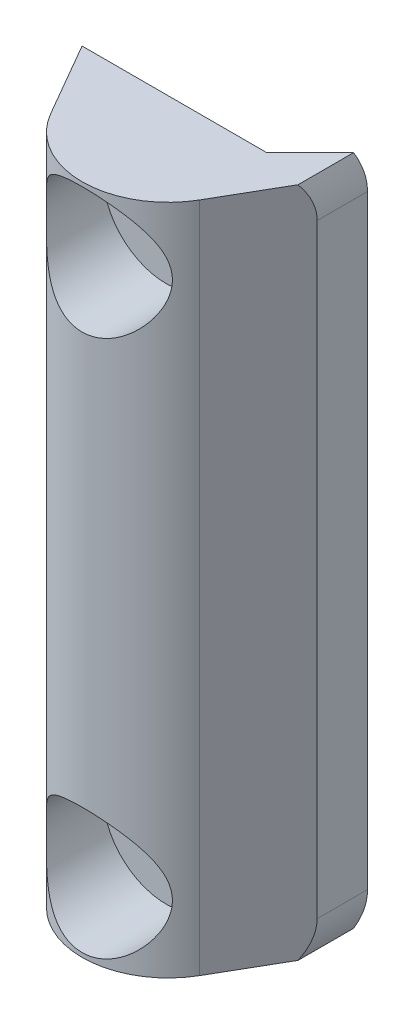
ISO-10303-21;
HEADER;
FILE_DESCRIPTION(('STEP AP214'),'2;1');
FILE_NAME('part.step','',(''),(''),'','','');
FILE_SCHEMA(('AUTOMOTIVE_DESIGN { 1 0 10303 214 1 1 1 1 }'));
ENDSEC;
DATA;
#1=APPLICATION_CONTEXT('core data for automotive mechanical design processes');
#2=APPLICATION_PROTOCOL_DEFINITION('international standard','automotive_design',2000,#1);
#3=PRODUCT_CONTEXT('',#1,'mechanical');
#4=PRODUCT('Part','Part','',(#3));
#5=PRODUCT_RELATED_PRODUCT_CATEGORY('part','',(#4));
#6=PRODUCT_DEFINITION_FORMATION('','',#4);
#7=PRODUCT_DEFINITION_CONTEXT('part definition',#1,'design');
#8=PRODUCT_DEFINITION('design','',#6,#7);
#9=PRODUCT_DEFINITION_SHAPE('','',#8);
#10=(LENGTH_UNIT() NAMED_UNIT(*) SI_UNIT(.MILLI.,.METRE.));
#11=(NAMED_UNIT(*) PLANE_ANGLE_UNIT() SI_UNIT($,.RADIAN.));
#12=(NAMED_UNIT(*) SI_UNIT($,.STERADIAN.) SOLID_ANGLE_UNIT());
#13=UNCERTAINTY_MEASURE_WITH_UNIT(LENGTH_MEASURE(1.E-05),#10,'distance_accuracy_value','');
#14=(GEOMETRIC_REPRESENTATION_CONTEXT(3) GLOBAL_UNCERTAINTY_ASSIGNED_CONTEXT((#13)) GLOBAL_UNIT_ASSIGNED_CONTEXT((#10,
#11,#12)) REPRESENTATION_CONTEXT('',''));
#15=CARTESIAN_POINT('',(0.,0.,0.));
#16=DIRECTION('',(0.,0.,1.));
#17=DIRECTION('',(1.,0.,0.));
#18=AXIS2_PLACEMENT_3D('',#15,#16,#17);
#19=CARTESIAN_POINT('',(7.00000000000001,44.2426406871193,-1.8756443470178));
#20=DIRECTION('',(-1.,0.,0.));
#21=DIRECTION('',(0.,0.,1.));
#22=AXIS2_PLACEMENT_3D('',#19,#20,#21);
#23=PLANE('',#22);
#24=DIRECTION('',(0.,0.,1.));
#25=VECTOR('',#24,1.);
#26=CARTESIAN_POINT('',(7.,38.,-4.8766443470178));
#27=LINE('',#26,#25);
#28=CARTESIAN_POINT('',(7.00000000000001,38.,-4.8756443470178));
#29=VERTEX_POINT('',#28);
#30=CARTESIAN_POINT('',(7.,38.,-1.8756443470178));
#31=VERTEX_POINT('',#30);
#32=EDGE_CURVE('E62',#29,#31,#27,.T.);
#33=ORIENTED_EDGE('',*,*,#32,.T.);
#34=DIRECTION('',(0.,-1.,0.));
#35=VECTOR('',#34,1.);
#36=CARTESIAN_POINT('',(7.,40.,-1.8756443470178));
#37=LINE('',#36,#35);
#38=CARTESIAN_POINT('',(7.,2.,-1.8756443470178));
#39=VERTEX_POINT('',#38);
#40=EDGE_CURVE('E47',#31,#39,#37,.T.);
#41=ORIENTED_EDGE('',*,*,#40,.T.);
#42=DIRECTION('',(0.,0.,1.));
#43=VECTOR('',#42,1.);
#44=CARTESIAN_POINT('',(7.,2.,-4.8766443470178));
#45=LINE('',#44,#43);
#46=CARTESIAN_POINT('',(7.,2.,-4.8756443470178));
#47=VERTEX_POINT('',#46);
#48=EDGE_CURVE('E254',#47,#39,#45,.T.);
#49=ORIENTED_EDGE('',*,*,#48,.F.);
#50=DIRECTION('',(0.,-1.,0.));
#51=VECTOR('',#50,1.);
#52=CARTESIAN_POINT('',(7.00000000000001,44.2426406871193,-4.8756443470178));
#53=LINE('',#52,#51);
#54=EDGE_CURVE('E109',#29,#47,#53,.T.);
#55=ORIENTED_EDGE('',*,*,#54,.F.);
#56=EDGE_LOOP('',(#33,#41,#49,#55));
#57=FACE_BOUND('',#56,.T.);
#58=ADVANCED_FACE('F39',(#57),#23,.F.);
#59=CARTESIAN_POINT('',(0.,40.,0.));
#60=DIRECTION('',(0.,-1.,0.));
#61=DIRECTION('',(0.,0.,-1.));
#62=AXIS2_PLACEMENT_3D('',#59,#60,#61);
#63=CYLINDRICAL_SURFACE('',#62,5.1243556529822);
#64=CARTESIAN_POINT('',(-3.75,4.,3.49235176610985));
#65=CARTESIAN_POINT('',(-3.75000082817432,3.91156320383128,3.4923503929677));
#66=CARTESIAN_POINT('',(-3.74686443987994,3.82313168687699,3.49572761415757));
#67=CARTESIAN_POINT('',(-3.73440650241471,3.64716548087393,3.50903280656132));
#68=CARTESIAN_POINT('',(-3.72508180563202,3.55963127124982,3.51896411142));
#69=CARTESIAN_POINT('',(-3.70045317631584,3.38612479252614,3.54485310385295));
#70=CARTESIAN_POINT('',(-3.68513600555023,3.30015642571689,3.560824131413));
#71=CARTESIAN_POINT('',(-3.64884911950112,3.13055641214242,3.5979987903687));
#72=CARTESIAN_POINT('',(-3.62787602935394,3.04692619353016,3.61920554526076));
#73=CARTESIAN_POINT('',(-3.55764701219401,2.80245512295211,3.68869235687381));
#74=CARTESIAN_POINT('',(-3.50071123533599,2.64555086867177,3.74325636214103));
#75=CARTESIAN_POINT('',(-3.36862678820535,2.34410112674241,3.86254921993245));
#76=CARTESIAN_POINT('',(-3.29347938898637,2.19955477754342,3.92727736295452));
#77=CARTESIAN_POINT('',(-3.11001622126509,1.89580077257696,4.07470778029398));
#78=CARTESIAN_POINT('',(-2.9980858523965,1.73927764365495,4.15844546242896));
#79=CARTESIAN_POINT('',(-2.75137587065141,1.4447396029857,4.32564396383491));
#80=CARTESIAN_POINT('',(-2.61656484441367,1.30675061012624,4.40910423943241));
#81=CARTESIAN_POINT('',(-2.38418627603352,1.10320159048506,4.53701527767008));
#82=CARTESIAN_POINT('',(-2.29360095879861,1.03091605576585,4.58359380421135));
#83=CARTESIAN_POINT('',(-2.1049834399495,0.894344831184097,4.67321659306353));
#84=CARTESIAN_POINT('',(-2.00695467575506,0.830055484395187,4.71626246788831));
#85=CARTESIAN_POINT('',(-1.8039623722087,0.710307427619104,4.79756929067917));
#86=CARTESIAN_POINT('',(-1.6990091978739,0.654835924496708,4.83583715306744));
#87=CARTESIAN_POINT('',(-1.48273692897054,0.553515411426955,4.90647135192091));
#88=CARTESIAN_POINT('',(-1.3714210068502,0.507661658441894,4.93884059627847));
#89=CARTESIAN_POINT('',(-1.09528751862583,0.409408797743708,5.00871284853145));
#90=CARTESIAN_POINT('',(-0.927606219137249,0.3623259055356,5.04267820189372));
#91=CARTESIAN_POINT('',(-0.584971203863564,0.291783435501948,5.09380013181278));
#92=CARTESIAN_POINT('',(-0.410023770764594,0.268303874239571,5.11097092691862));
#93=CARTESIAN_POINT('',(-0.057277843436265,0.24626833036834,5.12708126561203));
#94=CARTESIAN_POINT('',(0.120526374626158,0.247770924330748,5.1259779612745));
#95=CARTESIAN_POINT('',(0.473095590039999,0.275758452857493,5.10552712885448));
#96=CARTESIAN_POINT('',(0.647859808472965,0.302249696796877,5.08617499313165));
#97=CARTESIAN_POINT('',(0.984237682890889,0.377485057845345,5.03174799811459));
#98=CARTESIAN_POINT('',(1.14608851011734,0.425538263371641,4.9971618715286));
#99=CARTESIAN_POINT('',(1.45895354342908,0.541414323724202,4.91494382536017));
#100=CARTESIAN_POINT('',(1.60996550522692,0.609241258251981,4.86730921374631));
#101=CARTESIAN_POINT('',(1.91497554901795,0.770704495554478,4.75616008087093));
#102=CARTESIAN_POINT('',(2.06746978794979,0.866360945638147,4.69147424465704));
#103=CARTESIAN_POINT('',(2.35501682077639,1.07627887970656,4.55394060365824));
#104=CARTESIAN_POINT('',(2.49005291560229,1.19055794390402,4.48108510697752));
#105=CARTESIAN_POINT('',(2.76584301755128,1.4590498885554,4.31734707814518));
#106=CARTESIAN_POINT('',(2.90276785283969,1.61672151442978,4.22567816419438));
#107=CARTESIAN_POINT('',(3.14941285461441,1.95370641921429,4.04518588365832));
#108=CARTESIAN_POINT('',(3.25912731212652,2.13302422796882,3.956363117618));
#109=CARTESIAN_POINT('',(3.42856598000011,2.47185780264757,3.80968757206284));
#110=CARTESIAN_POINT('',(3.49396290111176,2.62741254266326,3.749273291527));
#111=CARTESIAN_POINT('',(3.60414116317493,2.95041503400739,3.6434935773444));
#112=CARTESIAN_POINT('',(3.64896890613842,3.11783502283541,3.59809433656822));
#113=CARTESIAN_POINT('',(3.7096537583566,3.43248658313399,3.53540473342253));
#114=CARTESIAN_POINT('',(3.7291428270886,3.57830512029839,3.51464561666011));
#115=CARTESIAN_POINT('',(3.75073209825572,3.87263095546328,3.4916054834624));
#116=CARTESIAN_POINT('',(3.75284848837487,4.02113562118611,3.48930726539356));
#117=CARTESIAN_POINT('',(3.73955912674523,4.31624859774321,3.50353990890408));
#118=CARTESIAN_POINT('',(3.72417033805529,4.46285860542798,3.52005254221004));
#119=CARTESIAN_POINT('',(3.6770003320272,4.75067875417884,3.56928847393102));
#120=CARTESIAN_POINT('',(3.64519328109576,4.89188000751251,3.60203731626516));
#121=CARTESIAN_POINT('',(3.55114333597889,5.22141242593584,3.69517269176667));
#122=CARTESIAN_POINT('',(3.48181890272556,5.40605147067521,3.76137341581564));
#123=CARTESIAN_POINT('',(3.31796343369188,5.75827480309253,3.90668002928197));
#124=CARTESIAN_POINT('',(3.22338170646956,5.92582384607056,3.98581174589469));
#125=CARTESIAN_POINT('',(3.00783875750046,6.24813399468713,4.15101767964003));
#126=CARTESIAN_POINT('',(2.88614737724377,6.40233393905878,4.23723139320089));
#127=CARTESIAN_POINT('',(2.61953534941129,6.6905491066411,4.40704654617036));
#128=CARTESIAN_POINT('',(2.47463303875232,6.82458010278618,4.49064998593749));
#129=CARTESIAN_POINT('',(2.1670954735174,7.06646385418011,4.64666211664988));
#130=CARTESIAN_POINT('',(2.00513169055618,7.17498752674977,4.71933351398692));
#131=CARTESIAN_POINT('',(1.74789093084761,7.31919682734582,4.81792228908631));
#132=CARTESIAN_POINT('',(1.65971602582111,7.36418757953933,4.84906118983569));
#133=CARTESIAN_POINT('',(1.4789686683686,7.44746848942779,4.90720560844916));
#134=CARTESIAN_POINT('',(1.38639838123594,7.48576190376258,4.93421313442543));
#135=CARTESIAN_POINT('',(1.19647491265102,7.55545719838755,4.98369238250594));
#136=CARTESIAN_POINT('',(1.09908514298867,7.58679139261743,5.00611939837496));
#137=CARTESIAN_POINT('',(0.901082996502705,7.64157823134256,5.04551782420225));
#138=CARTESIAN_POINT('',(0.80047238581423,7.66503511690888,5.06249216961396));
#139=CARTESIAN_POINT('',(0.596923448359583,7.70363402266335,5.09050582711305));
#140=CARTESIAN_POINT('',(0.493986795213196,7.71878183471628,5.10154927323901));
#141=CARTESIAN_POINT('',(0.286740051720917,7.74047185397086,5.11738164077908));
#142=CARTESIAN_POINT('',(0.182430199011517,7.74701553087615,5.12217163036786));
#143=CARTESIAN_POINT('',(-0.0109633453945503,7.75104002992471,5.1251167929883));
#144=CARTESIAN_POINT('',(-0.100011737006673,7.74972062562361,5.12415031948625));
#145=CARTESIAN_POINT('',(-0.277648615148562,7.74076484987677,5.11760031659005));
#146=CARTESIAN_POINT('',(-0.366236952921188,7.73312654939335,5.11201537726716));
#147=CARTESIAN_POINT('',(-0.542221826026499,7.71165032106709,5.09635305678598));
#148=CARTESIAN_POINT('',(-0.62961881038633,7.69781479952147,5.08627741931265));
#149=CARTESIAN_POINT('',(-0.802656854875991,7.66415412387097,5.06185885610123));
#150=CARTESIAN_POINT('',(-0.888297216091423,7.64432663325605,5.04751426575981));
#151=CARTESIAN_POINT('',(-1.13709754612317,7.57748350211404,4.99939484586397));
#152=CARTESIAN_POINT('',(-1.29712542764351,7.52247043390165,4.96006025024908));
#153=CARTESIAN_POINT('',(-1.60525921947084,7.39317584017375,4.86909265440706));
#154=CARTESIAN_POINT('',(-1.75336321670969,7.31889123077235,4.81745768594811));
#155=CARTESIAN_POINT('',(-2.05434133397981,7.142674870997,4.6976803726084));
#156=CARTESIAN_POINT('',(-2.20533617957929,7.03840528453739,4.62826502639304));
#157=CARTESIAN_POINT('',(-2.48868819592045,6.81105070034733,4.48229032157381));
#158=CARTESIAN_POINT('',(-2.6210210072957,6.68794154041413,4.40572183873494));
#159=CARTESIAN_POINT('',(-2.88972930159774,6.39957683584175,4.23537025345729));
#160=CARTESIAN_POINT('',(-3.02199826177563,6.23076796460607,4.14110571120786));
#161=CARTESIAN_POINT('',(-3.25719016234416,5.87066992653446,3.95876319073521));
#162=CARTESIAN_POINT('',(-3.36012739980856,5.67939177626338,3.87068221430793));
#163=CARTESIAN_POINT('',(-3.50857437979428,5.33306233683188,3.73576857499278));
#164=CARTESIAN_POINT('',(-3.56208947600469,5.18324604063859,3.6843373664763));
#165=CARTESIAN_POINT('',(-3.65023957482124,4.87401201106346,3.59703563376909));
#166=CARTESIAN_POINT('',(-3.68493374049539,4.71462613491002,3.56111642151695));
#167=CARTESIAN_POINT('',(-3.72263120371116,4.46146925030313,3.52156224930255));
#168=CARTESIAN_POINT('',(-3.73286403149255,4.36984640905222,3.51067488923838));
#169=CARTESIAN_POINT('',(-3.74654850945765,4.18548055527625,3.49606982410668));
#170=CARTESIAN_POINT('',(-3.74999913155252,4.09273737506678,3.49235320602631));
#171=CARTESIAN_POINT('',(-3.75,4.,3.49235176610985));
#172=B_SPLINE_CURVE_WITH_KNOTS('',3,(#64,#65,#66,#67,#68,#69,#70,#71,#72,#73,#74,#75,#76,#77,
#78,#79,#80,#81,#82,#83,#84,#85,#86,#87,#88,#89,#90,#91,#92,#93,#94,#95,#96,#97,#98,#99,#100,
#101,#102,#103,#104,#105,#106,#107,#108,#109,#110,#111,#112,#113,#114,#115,#116,#117,#118,#119,
#120,#121,#122,#123,#124,#125,#126,#127,#128,#129,#130,#131,#132,#133,#134,#135,#136,#137,#138,
#139,#140,#141,#142,#143,#144,#145,#146,#147,#148,#149,#150,#151,#152,#153,#154,#155,#156,#157,
#158,#159,#160,#161,#162,#163,#164,#165,#166,#167,#168,#169,#170,#171),.UNSPECIFIED.,.T.,.F.,(4,
2,2,2,2,2,2,2,2,2,2,2,2,2,2,2,2,2,2,2,2,2,2,2,2,2,2,2,2,2,2,2,2,2,2,2,2,2,2,2,2,2,2,2,2,2,2,2,2,
2,2,2,2,4),(0.,0.265184115268342,0.530503216866103,0.796411786414826,1.06247937493041,
1.58707998430188,2.11164399047701,2.73908808760229,3.36740068998937,3.74165360201563,
4.11573472125798,4.48926806134014,4.86261675636446,5.39249909476907,5.92193243676647,
6.4526073351557,6.98341625933047,7.49831242020413,8.01331488935537,8.58505393881181,
9.15733588466361,9.83886179141826,10.5205305675074,11.0564824523599,11.5912192660943,
12.0349544240141,12.4782760670688,12.9211684834505,13.3647599103506,13.9854631802866,
14.6074216896212,15.2487606438716,15.8895954089776,16.5109855741032,16.8219774559473,
17.1328176922315,17.4465603011581,17.7601337221012,18.0734882870825,18.3867893198737,
18.6536424770596,18.920577129466,19.1874082244798,19.4543435022329,19.9732447109827,
20.492229007028,21.0786263614804,21.6657821869552,22.3657271371811,23.0653303294403,
23.5653249981725,24.063738703474,24.3417762715041,24.6198559829455),.UNSPECIFIED.);
#173=CARTESIAN_POINT('',(-3.75,4.,3.49235176610985));
#174=VERTEX_POINT('',#173);
#175=EDGE_CURVE('E152',#174,#174,#172,.T.);
#176=ORIENTED_EDGE('',*,*,#175,.F.);
#177=EDGE_LOOP('',(#176));
#178=FACE_BOUND('',#177,.T.);
#179=CARTESIAN_POINT('',(-3.75,36.,3.49235176610986));
#180=CARTESIAN_POINT('',(-3.75000082817432,35.9115632038313,3.49235039296771));
#181=CARTESIAN_POINT('',(-3.74686443987994,35.823131686877,3.49572761415758));
#182=CARTESIAN_POINT('',(-3.7344065024147,35.6471654808739,3.50903280656133));
#183=CARTESIAN_POINT('',(-3.72508180563202,35.5596312712498,3.51896411142));
#184=CARTESIAN_POINT('',(-3.70045317631583,35.3861247925261,3.54485310385296));
#185=CARTESIAN_POINT('',(-3.68513600555022,35.3001564257169,3.560824131413));
#186=CARTESIAN_POINT('',(-3.64884911950112,35.1305564121424,3.5979987903687));
#187=CARTESIAN_POINT('',(-3.62787602935393,35.0469261935302,3.61920554526077));
#188=CARTESIAN_POINT('',(-3.557647012194,34.8024551229521,3.68869235687382));
#189=CARTESIAN_POINT('',(-3.50071123533599,34.6455508686718,3.74325636214103));
#190=CARTESIAN_POINT('',(-3.36862678820535,34.3441011267424,3.86254921993245));
#191=CARTESIAN_POINT('',(-3.29347938898637,34.1995547775434,3.92727736295452));
#192=CARTESIAN_POINT('',(-3.1100162212651,33.895800772577,4.07470778029398));
#193=CARTESIAN_POINT('',(-2.9980858523965,33.739277643655,4.15844546242896));
#194=CARTESIAN_POINT('',(-2.75137587065141,33.4447396029857,4.32564396383491));
#195=CARTESIAN_POINT('',(-2.61656484441367,33.3067506101262,4.40910423943241));
#196=CARTESIAN_POINT('',(-2.38418627603352,33.1032015904851,4.53701527767008));
#197=CARTESIAN_POINT('',(-2.29360095879861,33.0309160557659,4.58359380421135));
#198=CARTESIAN_POINT('',(-2.10498343994949,32.8943448311841,4.67321659306353));
#199=CARTESIAN_POINT('',(-2.00695467575506,32.8300554843952,4.71626246788831));
#200=CARTESIAN_POINT('',(-1.8039623722087,32.7103074276191,4.79756929067917));
#201=CARTESIAN_POINT('',(-1.6990091978739,32.6548359244967,4.83583715306744));
#202=CARTESIAN_POINT('',(-1.48273692897054,32.553515411427,4.90647135192091));
#203=CARTESIAN_POINT('',(-1.3714210068502,32.5076616584419,4.93884059627847));
#204=CARTESIAN_POINT('',(-1.09528751862583,32.4094087977437,5.00871284853145));
#205=CARTESIAN_POINT('',(-0.927606219137248,32.3623259055356,5.04267820189372));
#206=CARTESIAN_POINT('',(-0.584971203863563,32.2917834355019,5.09380013181278));
#207=CARTESIAN_POINT('',(-0.410023770764593,32.2683038742396,5.11097092691862));
#208=CARTESIAN_POINT('',(-0.0572778434362653,32.2462683303683,5.12708126561203));
#209=CARTESIAN_POINT('',(0.120526374626157,32.2477709243308,5.1259779612745));
#210=CARTESIAN_POINT('',(0.473095590039998,32.2757584528575,5.10552712885448));
#211=CARTESIAN_POINT('',(0.647859808472965,32.3022496967969,5.08617499313165));
#212=CARTESIAN_POINT('',(0.984237682890889,32.3774850578453,5.03174799811459));
#213=CARTESIAN_POINT('',(1.14608851011734,32.4255382633716,4.9971618715286));
#214=CARTESIAN_POINT('',(1.45895354342908,32.5414143237242,4.91494382536017));
#215=CARTESIAN_POINT('',(1.60996550522692,32.609241258252,4.86730921374631));
#216=CARTESIAN_POINT('',(1.91497554901795,32.7707044955545,4.75616008087093));
#217=CARTESIAN_POINT('',(2.06746978794979,32.8663609456381,4.69147424465704));
#218=CARTESIAN_POINT('',(2.35501682077639,33.0762788797066,4.55394060365823));
#219=CARTESIAN_POINT('',(2.49005291560229,33.190557943904,4.48108510697751));
#220=CARTESIAN_POINT('',(2.76584301755129,33.4590498885554,4.31734707814518));
#221=CARTESIAN_POINT('',(2.9027678528397,33.6167215144298,4.22567816419437));
#222=CARTESIAN_POINT('',(3.14941285461441,33.9537064192143,4.04518588365831));
#223=CARTESIAN_POINT('',(3.25912731212653,34.1330242279688,3.95636311761799));
#224=CARTESIAN_POINT('',(3.42856598000012,34.4718578026476,3.80968757206283));
#225=CARTESIAN_POINT('',(3.49396290111177,34.6274125426633,3.74927329152699));
#226=CARTESIAN_POINT('',(3.60414116317494,34.9504150340074,3.6434935773444));
#227=CARTESIAN_POINT('',(3.64896890613843,35.1178350228354,3.59809433656822));
#228=CARTESIAN_POINT('',(3.7096537583566,35.432486583134,3.53540473342252));
#229=CARTESIAN_POINT('',(3.72914282708861,35.5783051202984,3.5146456166601));
#230=CARTESIAN_POINT('',(3.75073209825572,35.8726309554633,3.4916054834624));
#231=CARTESIAN_POINT('',(3.75284848837488,36.0211356211861,3.48930726539356));
#232=CARTESIAN_POINT('',(3.73955912674523,36.3162485977432,3.50353990890408));
#233=CARTESIAN_POINT('',(3.7241703380553,36.462858605428,3.52005254221003));
#234=CARTESIAN_POINT('',(3.67700033202721,36.7506787541788,3.56928847393101));
#235=CARTESIAN_POINT('',(3.64519328109577,36.8918800075125,3.60203731626515));
#236=CARTESIAN_POINT('',(3.55114333597889,37.2214124259359,3.69517269176666));
#237=CARTESIAN_POINT('',(3.48181890272556,37.4060514706752,3.76137341581563));
#238=CARTESIAN_POINT('',(3.31796343369189,37.7582748030925,3.90668002928197));
#239=CARTESIAN_POINT('',(3.22338170646956,37.9258238460706,3.98581174589468));
#240=CARTESIAN_POINT('',(3.00783875750046,38.2481339946871,4.15101767964002));
#241=CARTESIAN_POINT('',(2.88614737724378,38.4023339390588,4.23723139320089));
#242=CARTESIAN_POINT('',(2.6195353494113,38.6905491066411,4.40704654617035));
#243=CARTESIAN_POINT('',(2.47463303875233,38.8245801027862,4.49064998593748));
#244=CARTESIAN_POINT('',(2.16709547351741,39.0664638541801,4.64666211664987));
#245=CARTESIAN_POINT('',(2.00513169055619,39.1749875267498,4.71933351398692));
#246=CARTESIAN_POINT('',(1.74789093084761,39.3191968273458,4.81792228908631));
#247=CARTESIAN_POINT('',(1.65971602582112,39.3641875795393,4.84906118983569));
#248=CARTESIAN_POINT('',(1.47896866836861,39.4474684894278,4.90720560844916));
#249=CARTESIAN_POINT('',(1.38639838123595,39.4857619037626,4.93421313442543));
#250=CARTESIAN_POINT('',(1.19647491265103,39.5554571983876,4.98369238250594));
#251=CARTESIAN_POINT('',(1.09908514298868,39.5867913926174,5.00611939837496));
#252=CARTESIAN_POINT('',(0.901082996502713,39.6415782313426,5.04551782420225));
#253=CARTESIAN_POINT('',(0.800472385814238,39.6650351169089,5.06249216961396));
#254=CARTESIAN_POINT('',(0.596923448359591,39.7036340226634,5.09050582711305));
#255=CARTESIAN_POINT('',(0.493986795213202,39.7187818347163,5.10154927323901));
#256=CARTESIAN_POINT('',(0.286740051720923,39.7404718539709,5.11738164077908));
#257=CARTESIAN_POINT('',(0.182430199011523,39.7470155308762,5.12217163036786));
#258=CARTESIAN_POINT('',(-0.0109633453945442,39.7510400299247,5.1251167929883));
#259=CARTESIAN_POINT('',(-0.100011737006667,39.7497206256236,5.12415031948625));
#260=CARTESIAN_POINT('',(-0.277648615148555,39.7407648498768,5.11760031659005));
#261=CARTESIAN_POINT('',(-0.366236952921181,39.7331265493934,5.11201537726716));
#262=CARTESIAN_POINT('',(-0.542221826026493,39.7116503210671,5.09635305678598));
#263=CARTESIAN_POINT('',(-0.629618810386326,39.6978147995215,5.08627741931265));
#264=CARTESIAN_POINT('',(-0.802656854875988,39.664154123871,5.06185885610123));
#265=CARTESIAN_POINT('',(-0.88829721609142,39.6443266332561,5.04751426575981));
#266=CARTESIAN_POINT('',(-1.13709754612317,39.577483502114,4.99939484586397));
#267=CARTESIAN_POINT('',(-1.29712542764351,39.5224704339017,4.96006025024908));
#268=CARTESIAN_POINT('',(-1.60525921947084,39.3931758401738,4.86909265440706));
#269=CARTESIAN_POINT('',(-1.75336321670969,39.3188912307724,4.81745768594811));
#270=CARTESIAN_POINT('',(-2.05434133397981,39.142674870997,4.6976803726084));
#271=CARTESIAN_POINT('',(-2.20533617957928,39.0384052845374,4.62826502639305));
#272=CARTESIAN_POINT('',(-2.48868819592045,38.8110507003473,4.48229032157382));
#273=CARTESIAN_POINT('',(-2.6210210072957,38.6879415404141,4.40572183873494));
#274=CARTESIAN_POINT('',(-2.88972930159774,38.3995768358418,4.23537025345729));
#275=CARTESIAN_POINT('',(-3.02199826177563,38.2307679646061,4.14110571120786));
#276=CARTESIAN_POINT('',(-3.25719016234415,37.8706699265345,3.95876319073521));
#277=CARTESIAN_POINT('',(-3.36012739980855,37.6793917762634,3.87068221430793));
#278=CARTESIAN_POINT('',(-3.50857437979428,37.3330623368319,3.73576857499279));
#279=CARTESIAN_POINT('',(-3.56208947600468,37.1832460406386,3.6843373664763));
#280=CARTESIAN_POINT('',(-3.65023957482124,36.8740120110635,3.5970356337691));
#281=CARTESIAN_POINT('',(-3.68493374049539,36.71462613491,3.56111642151696));
#282=CARTESIAN_POINT('',(-3.72263120371116,36.4614692503031,3.52156224930255));
#283=CARTESIAN_POINT('',(-3.73286403149255,36.3698464090522,3.51067488923838));
#284=CARTESIAN_POINT('',(-3.74654850945765,36.1854805552762,3.49606982410668));
#285=CARTESIAN_POINT('',(-3.74999913155252,36.0927373750668,3.49235320602632));
#286=CARTESIAN_POINT('',(-3.75,36.,3.49235176610986));
#287=B_SPLINE_CURVE_WITH_KNOTS('',3,(#179,#180,#181,#182,#183,#184,#185,#186,#187,#188,#189,
#190,#191,#192,#193,#194,#195,#196,#197,#198,#199,#200,#201,#202,#203,#204,#205,#206,#207,#208,
#209,#210,#211,#212,#213,#214,#215,#216,#217,#218,#219,#220,#221,#222,#223,#224,#225,#226,#227,
#228,#229,#230,#231,#232,#233,#234,#235,#236,#237,#238,#239,#240,#241,#242,#243,#244,#245,#246,
#247,#248,#249,#250,#251,#252,#253,#254,#255,#256,#257,#258,#259,#260,#261,#262,#263,#264,#265,
#266,#267,#268,#269,#270,#271,#272,#273,#274,#275,#276,#277,#278,#279,#280,#281,#282,#283,#284,
#285,#286),.UNSPECIFIED.,.T.,.F.,(4,2,2,2,2,2,2,2,2,2,2,2,2,2,2,2,2,2,2,2,2,2,2,2,2,2,2,2,2,2,2,
2,2,2,2,2,2,2,2,2,2,2,2,2,2,2,2,2,2,2,2,2,2,4),(0.,0.265184115268347,0.530503216866113,
0.796411786414833,1.06247937493041,1.58707998430188,2.111643990477,2.73908808760228,
3.36740068998936,3.74165360201563,4.11573472125797,4.48926806134013,4.86261675636446,
5.39249909476906,5.92193243676646,6.45260733515569,6.98341625933047,7.49831242020413,
8.01331488935537,8.58505393881181,9.15733588466361,9.83886179141826,10.5205305675074,
11.0564824523599,11.5912192660943,12.0349544240141,12.4782760670688,12.9211684834505,
13.3647599103506,13.9854631802866,14.6074216896212,15.2487606438716,15.8895954089776,
16.5109855741032,16.8219774559474,17.1328176922315,17.4465603011581,17.7601337221012,
18.0734882870825,18.3867893198737,18.6536424770596,18.920577129466,19.1874082244798,
19.4543435022329,19.9732447109827,20.492229007028,21.0786263614804,21.6657821869552,
22.3657271371811,23.0653303294403,23.5653249981725,24.063738703474,24.3417762715041,
24.6198559829455),.UNSPECIFIED.);
#288=CARTESIAN_POINT('',(-3.75,36.,3.49235176610986));
#289=VERTEX_POINT('',#288);
#290=EDGE_CURVE('E162',#289,#289,#287,.T.);
#291=ORIENTED_EDGE('',*,*,#290,.F.);
#292=EDGE_LOOP('',(#291));
#293=FACE_BOUND('',#292,.T.);
#294=CARTESIAN_POINT('',(0.,0.,0.));
#295=DIRECTION('',(0.,1.,0.));
#296=DIRECTION('',(0.,0.,1.));
#297=AXIS2_PLACEMENT_3D('',#294,#295,#296);
#298=CIRCLE('',#297,5.1243556529822);
#299=CARTESIAN_POINT('',(-4.43782217350899,0.,2.56217782649107));
#300=VERTEX_POINT('',#299);
#301=CARTESIAN_POINT('',(4.43782217350899,0.,2.56217782649107));
#302=VERTEX_POINT('',#301);
#303=EDGE_CURVE('E138',#300,#302,#298,.T.);
#304=ORIENTED_EDGE('',*,*,#303,.T.);
#305=DIRECTION('',(0.,-1.,0.));
#306=VECTOR('',#305,1.);
#307=CARTESIAN_POINT('',(4.43782217350899,40.,2.56217782649107));
#308=LINE('',#307,#306);
#309=CARTESIAN_POINT('',(4.43782217350899,40.,2.56217782649107));
#310=VERTEX_POINT('',#309);
#311=EDGE_CURVE('E11',#310,#302,#308,.T.);
#312=ORIENTED_EDGE('',*,*,#311,.F.);
#313=CARTESIAN_POINT('',(0.,40.,0.));
#314=DIRECTION('',(0.,1.,0.));
#315=DIRECTION('',(0.,0.,1.));
#316=AXIS2_PLACEMENT_3D('',#313,#314,#315);
#317=CIRCLE('',#316,5.1243556529822);
#318=CARTESIAN_POINT('',(-4.43782217350899,40.,2.56217782649107));
#319=VERTEX_POINT('',#318);
#320=EDGE_CURVE('E133',#319,#310,#317,.T.);
#321=ORIENTED_EDGE('',*,*,#320,.F.);
#322=DIRECTION('',(0.,-1.,0.));
#323=VECTOR('',#322,1.);
#324=CARTESIAN_POINT('',(-4.43782217350899,40.,2.56217782649107));
#325=LINE('',#324,#323);
#326=EDGE_CURVE('E125',#319,#300,#325,.T.);
#327=ORIENTED_EDGE('',*,*,#326,.T.);
#328=EDGE_LOOP('',(#304,#312,#321,#327));
#329=FACE_BOUND('',#328,.T.);
#330=ADVANCED_FACE('F41',(#178,#293,#329),#63,.T.);
#331=CARTESIAN_POINT('',(7.,40.,-1.8756443470178));
#332=DIRECTION('',(-0.866025403784441,0.,-0.499999999999995));
#333=DIRECTION('',(-0.499999999999995,0.,0.866025403784441));
#334=AXIS2_PLACEMENT_3D('',#331,#332,#333);
#335=PLANE('',#334);
#336=DIRECTION('',(0.499999999999995,0.,-0.866025403784441));
#337=VECTOR('',#336,1.);
#338=CARTESIAN_POINT('',(7.,0.,-1.8756443470178));
#339=LINE('',#338,#337);
#340=CARTESIAN_POINT('',(6.58257569495584,0.,-1.15264424236718));
#341=VERTEX_POINT('',#340);
#342=EDGE_CURVE('E136',#302,#341,#339,.T.);
#343=ORIENTED_EDGE('',*,*,#342,.T.);
#344=CARTESIAN_POINT('',(2.,2.,6.78460969082669));
#345=DIRECTION('',(-0.866025403784441,0.,-0.499999999999995));
#346=DIRECTION('',(0.499999999999995,0.,-0.866025403784441));
#347=AXIS2_PLACEMENT_3D('',#344,#345,#346);
#348=ELLIPSE('',#347,10.0000000000001,5.);
#349=EDGE_CURVE('E119',#39,#341,#348,.T.);
#350=ORIENTED_EDGE('',*,*,#349,.F.);
#351=ORIENTED_EDGE('',*,*,#40,.F.);
#352=CARTESIAN_POINT('',(2.,38.,6.78460969082669));
#353=DIRECTION('',(-0.866025403784441,0.,-0.499999999999995));
#354=DIRECTION('',(0.499999999999995,0.,-0.866025403784441));
#355=AXIS2_PLACEMENT_3D('',#352,#353,#354);
#356=ELLIPSE('',#355,10.0000000000001,5.);
#357=CARTESIAN_POINT('',(6.58257569495584,40.,-1.15264424236718));
#358=VERTEX_POINT('',#357);
#359=EDGE_CURVE('E114',#358,#31,#356,.T.);
#360=ORIENTED_EDGE('',*,*,#359,.F.);
#361=DIRECTION('',(0.499999999999995,0.,-0.866025403784441));
#362=VECTOR('',#361,1.);
#363=CARTESIAN_POINT('',(7.,40.,-1.8756443470178));
#364=LINE('',#363,#362);
#365=EDGE_CURVE('E145',#310,#358,#364,.T.);
#366=ORIENTED_EDGE('',*,*,#365,.F.);
#367=ORIENTED_EDGE('',*,*,#311,.T.);
#368=EDGE_LOOP('',(#343,#350,#351,#360,#366,#367));
#369=FACE_BOUND('',#368,.T.);
#370=ADVANCED_FACE('F122',(#369),#335,.F.);
#371=CARTESIAN_POINT('',(-7.,40.,-1.8756443470178));
#372=DIRECTION('',(0.,0.,1.));
#373=DIRECTION('',(1.,0.,0.));
#374=AXIS2_PLACEMENT_3D('',#371,#372,#373);
#375=PLANE('',#374);
#376=CARTESIAN_POINT('',(0.,4.,-1.8756443470178));
#377=DIRECTION('',(0.,0.,-1.));
#378=DIRECTION('',(-1.,0.,0.));
#379=AXIS2_PLACEMENT_3D('',#376,#377,#378);
#380=CIRCLE('',#379,1.6);
#381=CARTESIAN_POINT('',(-1.6,4.,-1.8756443470178));
#382=VERTEX_POINT('',#381);
#383=EDGE_CURVE('E141',#382,#382,#380,.T.);
#384=ORIENTED_EDGE('',*,*,#383,.F.);
#385=EDGE_LOOP('',(#384));
#386=FACE_BOUND('',#385,.T.);
#387=CARTESIAN_POINT('',(0.,36.,-1.8756443470178));
#388=DIRECTION('',(0.,0.,-1.));
#389=DIRECTION('',(-1.,0.,0.));
#390=AXIS2_PLACEMENT_3D('',#387,#388,#389);
#391=CIRCLE('',#390,1.6);
#392=CARTESIAN_POINT('',(-1.59999999999999,36.,-1.8756443470178));
#393=VERTEX_POINT('',#392);
#394=EDGE_CURVE('E149',#393,#393,#391,.T.);
#395=ORIENTED_EDGE('',*,*,#394,.F.);
#396=EDGE_LOOP('',(#395));
#397=FACE_BOUND('',#396,.T.);
#398=DIRECTION('',(-1.,0.,0.));
#399=VECTOR('',#398,1.);
#400=CARTESIAN_POINT('',(-7.,40.,-1.8756443470178));
#401=LINE('',#400,#399);
#402=CARTESIAN_POINT('',(4.00000000000001,40.,-1.8756443470178));
#403=VERTEX_POINT('',#402);
#404=CARTESIAN_POINT('',(-7.,40.,-1.8756443470178));
#405=VERTEX_POINT('',#404);
#406=EDGE_CURVE('E143',#403,#405,#401,.T.);
#407=ORIENTED_EDGE('',*,*,#406,.F.);
#408=DIRECTION('',(0.,-1.,0.));
#409=VECTOR('',#408,1.);
#410=CARTESIAN_POINT('',(4.00000000000001,44.2426406871193,-1.8756443470178));
#411=LINE('',#410,#409);
#412=CARTESIAN_POINT('',(4.00000000000001,0.,-1.8756443470178));
#413=VERTEX_POINT('',#412);
#414=EDGE_CURVE('E110',#403,#413,#411,.T.);
#415=ORIENTED_EDGE('',*,*,#414,.T.);
#416=DIRECTION('',(-1.,0.,0.));
#417=VECTOR('',#416,1.);
#418=CARTESIAN_POINT('',(-7.,0.,-1.8756443470178));
#419=LINE('',#418,#417);
#420=CARTESIAN_POINT('',(-7.,0.,-1.8756443470178));
#421=VERTEX_POINT('',#420);
#422=EDGE_CURVE('E134',#413,#421,#419,.T.);
#423=ORIENTED_EDGE('',*,*,#422,.T.);
#424=DIRECTION('',(0.,-1.,0.));
#425=VECTOR('',#424,1.);
#426=CARTESIAN_POINT('',(-7.,40.,-1.8756443470178));
#427=LINE('',#426,#425);
#428=EDGE_CURVE('E123',#405,#421,#427,.T.);
#429=ORIENTED_EDGE('',*,*,#428,.F.);
#430=EDGE_LOOP('',(#407,#415,#423,#429));
#431=FACE_BOUND('',#430,.T.);
#432=ADVANCED_FACE('F202',(#386,#397,#431),#375,.F.);
#433=CARTESIAN_POINT('',(-4.43782217350899,40.,2.56217782649107));
#434=DIRECTION('',(0.866025403784442,0.,-0.499999999999995));
#435=DIRECTION('',(-0.499999999999995,0.,-0.866025403784442));
#436=AXIS2_PLACEMENT_3D('',#433,#434,#435);
#437=PLANE('',#436);
#438=DIRECTION('',(0.499999999999995,0.,0.866025403784441));
#439=VECTOR('',#438,1.);
#440=CARTESIAN_POINT('',(-4.43782217350899,0.,2.56217782649107));
#441=LINE('',#440,#439);
#442=EDGE_CURVE('E131',#421,#300,#441,.T.);
#443=ORIENTED_EDGE('',*,*,#442,.T.);
#444=ORIENTED_EDGE('',*,*,#326,.F.);
#445=DIRECTION('',(0.499999999999995,0.,0.866025403784441));
#446=VECTOR('',#445,1.);
#447=CARTESIAN_POINT('',(-4.43782217350899,40.,2.56217782649107));
#448=LINE('',#447,#446);
#449=EDGE_CURVE('E130',#405,#319,#448,.T.);
#450=ORIENTED_EDGE('',*,*,#449,.F.);
#451=ORIENTED_EDGE('',*,*,#428,.T.);
#452=EDGE_LOOP('',(#443,#444,#450,#451));
#453=FACE_BOUND('',#452,.T.);
#454=ADVANCED_FACE('F195',(#453),#437,.F.);
#455=CARTESIAN_POINT('',(0.,40.,0.));
#456=DIRECTION('',(0.,1.,0.));
#457=DIRECTION('',(0.,0.,1.));
#458=AXIS2_PLACEMENT_3D('',#455,#456,#457);
#459=PLANE('',#458);
#460=DIRECTION('',(0.,0.,-1.));
#461=VECTOR('',#460,1.);
#462=CARTESIAN_POINT('',(6.58257569495584,40.,5.1253556529822));
#463=LINE('',#462,#461);
#464=CARTESIAN_POINT('',(6.58257569495585,40.,-4.45822004197364));
#465=VERTEX_POINT('',#464);
#466=EDGE_CURVE('E116',#358,#465,#463,.T.);
#467=ORIENTED_EDGE('',*,*,#466,.T.);
#468=DIRECTION('',(-0.707106781186548,0.,0.707106781186548));
#469=VECTOR('',#468,1.);
#470=CARTESIAN_POINT('',(7.00000000000001,40.,-4.8756443470178));
#471=LINE('',#470,#469);
#472=EDGE_CURVE('E243',#465,#403,#471,.T.);
#473=ORIENTED_EDGE('',*,*,#472,.T.);
#474=ORIENTED_EDGE('',*,*,#406,.T.);
#475=ORIENTED_EDGE('',*,*,#449,.T.);
#476=ORIENTED_EDGE('',*,*,#320,.T.);
#477=ORIENTED_EDGE('',*,*,#365,.T.);
#478=EDGE_LOOP('',(#467,#473,#474,#475,#476,#477));
#479=FACE_BOUND('',#478,.T.);
#480=ADVANCED_FACE('F192',(#479),#459,.T.);
#481=CARTESIAN_POINT('',(0.,0.,0.));
#482=DIRECTION('',(0.,1.,0.));
#483=DIRECTION('',(0.,0.,1.));
#484=AXIS2_PLACEMENT_3D('',#481,#482,#483);
#485=PLANE('',#484);
#486=DIRECTION('',(-0.707106781186548,0.,0.707106781186548));
#487=VECTOR('',#486,1.);
#488=CARTESIAN_POINT('',(7.00000000000001,0.,-4.8756443470178));
#489=LINE('',#488,#487);
#490=CARTESIAN_POINT('',(6.58257569495584,0.,-4.45822004197364));
#491=VERTEX_POINT('',#490);
#492=EDGE_CURVE('E249',#491,#413,#489,.T.);
#493=ORIENTED_EDGE('',*,*,#492,.F.);
#494=DIRECTION('',(0.,0.,-1.));
#495=VECTOR('',#494,1.);
#496=CARTESIAN_POINT('',(6.58257569495584,0.,5.1253556529822));
#497=LINE('',#496,#495);
#498=EDGE_CURVE('E54',#341,#491,#497,.T.);
#499=ORIENTED_EDGE('',*,*,#498,.F.);
#500=ORIENTED_EDGE('',*,*,#342,.F.);
#501=ORIENTED_EDGE('',*,*,#303,.F.);
#502=ORIENTED_EDGE('',*,*,#442,.F.);
#503=ORIENTED_EDGE('',*,*,#422,.F.);
#504=EDGE_LOOP('',(#493,#499,#500,#501,#502,#503));
#505=FACE_BOUND('',#504,.T.);
#506=ADVANCED_FACE('F190',(#505),#485,.F.);
#507=CARTESIAN_POINT('',(0.,36.,5.1253556529822));
#508=DIRECTION('',(0.,0.,-1.));
#509=DIRECTION('',(-1.,0.,0.));
#510=AXIS2_PLACEMENT_3D('',#507,#508,#509);
#511=CYLINDRICAL_SURFACE('',#510,1.6);
#512=CARTESIAN_POINT('',(0.,36.,0.124355652982197));
#513=DIRECTION('',(0.,0.,-1.));
#514=DIRECTION('',(-1.,0.,0.));
#515=AXIS2_PLACEMENT_3D('',#512,#513,#514);
#516=CIRCLE('',#515,1.6);
#517=CARTESIAN_POINT('',(-1.59999999999999,36.,0.124355652982197));
#518=VERTEX_POINT('',#517);
#519=EDGE_CURVE('E159',#518,#518,#516,.T.);
#520=ORIENTED_EDGE('',*,*,#519,.F.);
#521=EDGE_LOOP('',(#520));
#522=FACE_BOUND('',#521,.T.);
#523=ORIENTED_EDGE('',*,*,#394,.T.);
#524=EDGE_LOOP('',(#523));
#525=FACE_BOUND('',#524,.T.);
#526=ADVANCED_FACE('F186',(#522,#525),#511,.F.);
#527=CARTESIAN_POINT('',(0.,4.,5.1253556529822));
#528=DIRECTION('',(0.,0.,-1.));
#529=DIRECTION('',(-1.,0.,0.));
#530=AXIS2_PLACEMENT_3D('',#527,#528,#529);
#531=CYLINDRICAL_SURFACE('',#530,1.6);
#532=CARTESIAN_POINT('',(0.,4.,0.124355652982197));
#533=DIRECTION('',(0.,0.,-1.));
#534=DIRECTION('',(-1.,0.,0.));
#535=AXIS2_PLACEMENT_3D('',#532,#533,#534);
#536=CIRCLE('',#535,1.6);
#537=CARTESIAN_POINT('',(-1.6,4.,0.124355652982197));
#538=VERTEX_POINT('',#537);
#539=EDGE_CURVE('E237',#538,#538,#536,.T.);
#540=ORIENTED_EDGE('',*,*,#539,.F.);
#541=EDGE_LOOP('',(#540));
#542=FACE_BOUND('',#541,.T.);
#543=ORIENTED_EDGE('',*,*,#383,.T.);
#544=EDGE_LOOP('',(#543));
#545=FACE_BOUND('',#544,.T.);
#546=ADVANCED_FACE('F182',(#542,#545),#531,.F.);
#547=CARTESIAN_POINT('',(0.,4.,5.1253556529822));
#548=DIRECTION('',(0.,0.,-1.));
#549=DIRECTION('',(-1.,0.,0.));
#550=AXIS2_PLACEMENT_3D('',#547,#548,#549);
#551=CYLINDRICAL_SURFACE('',#550,3.75);
#552=CARTESIAN_POINT('',(0.,4.,0.124355652982197));
#553=DIRECTION('',(0.,0.,-1.));
#554=DIRECTION('',(-1.,0.,0.));
#555=AXIS2_PLACEMENT_3D('',#552,#553,#554);
#556=CIRCLE('',#555,3.75);
#557=CARTESIAN_POINT('',(-3.75,4.,0.124355652982197));
#558=VERTEX_POINT('',#557);
#559=EDGE_CURVE('E158',#558,#558,#556,.T.);
#560=ORIENTED_EDGE('',*,*,#559,.T.);
#561=EDGE_LOOP('',(#560));
#562=FACE_BOUND('',#561,.T.);
#563=ORIENTED_EDGE('',*,*,#175,.T.);
#564=EDGE_LOOP('',(#563));
#565=FACE_BOUND('',#564,.T.);
#566=ADVANCED_FACE('F185',(#562,#565),#551,.F.);
#567=CARTESIAN_POINT('',(0.,4.,0.124355652982197));
#568=DIRECTION('',(0.,0.,-1.));
#569=DIRECTION('',(-1.,0.,0.));
#570=AXIS2_PLACEMENT_3D('',#567,#568,#569);
#571=PLANE('',#570);
#572=ORIENTED_EDGE('',*,*,#539,.T.);
#573=EDGE_LOOP('',(#572));
#574=FACE_BOUND('',#573,.T.);
#575=ORIENTED_EDGE('',*,*,#559,.F.);
#576=EDGE_LOOP('',(#575));
#577=FACE_BOUND('',#576,.T.);
#578=ADVANCED_FACE('F224',(#574,#577),#571,.F.);
#579=CARTESIAN_POINT('',(0.,36.,5.1253556529822));
#580=DIRECTION('',(0.,0.,-1.));
#581=DIRECTION('',(-1.,0.,0.));
#582=AXIS2_PLACEMENT_3D('',#579,#580,#581);
#583=CYLINDRICAL_SURFACE('',#582,3.75);
#584=CARTESIAN_POINT('',(0.,36.,0.124355652982197));
#585=DIRECTION('',(0.,0.,-1.));
#586=DIRECTION('',(-1.,0.,0.));
#587=AXIS2_PLACEMENT_3D('',#584,#585,#586);
#588=CIRCLE('',#587,3.75);
#589=CARTESIAN_POINT('',(-3.75,36.,0.124355652982197));
#590=VERTEX_POINT('',#589);
#591=EDGE_CURVE('E155',#590,#590,#588,.T.);
#592=ORIENTED_EDGE('',*,*,#591,.T.);
#593=EDGE_LOOP('',(#592));
#594=FACE_BOUND('',#593,.T.);
#595=ORIENTED_EDGE('',*,*,#290,.T.);
#596=EDGE_LOOP('',(#595));
#597=FACE_BOUND('',#596,.T.);
#598=ADVANCED_FACE('F176',(#594,#597),#583,.F.);
#599=CARTESIAN_POINT('',(0.,36.,0.124355652982197));
#600=DIRECTION('',(0.,0.,-1.));
#601=DIRECTION('',(-1.,0.,0.));
#602=AXIS2_PLACEMENT_3D('',#599,#600,#601);
#603=PLANE('',#602);
#604=ORIENTED_EDGE('',*,*,#519,.T.);
#605=EDGE_LOOP('',(#604));
#606=FACE_BOUND('',#605,.T.);
#607=ORIENTED_EDGE('',*,*,#591,.F.);
#608=EDGE_LOOP('',(#607));
#609=FACE_BOUND('',#608,.T.);
#610=ADVANCED_FACE('F181',(#606,#609),#603,.F.);
#611=CARTESIAN_POINT('',(2.,2.,5.1253556529822));
#612=DIRECTION('',(0.,0.,-1.));
#613=DIRECTION('',(-1.,0.,0.));
#614=AXIS2_PLACEMENT_3D('',#611,#612,#613);
#615=CYLINDRICAL_SURFACE('',#614,5.);
#616=ORIENTED_EDGE('',*,*,#349,.T.);
#617=ORIENTED_EDGE('',*,*,#498,.T.);
#618=CARTESIAN_POINT('',(2.,2.,0.124355652982202));
#619=DIRECTION('',(0.707106781186548,0.,0.707106781186548));
#620=DIRECTION('',(-0.707106781186548,0.,0.707106781186548));
#621=AXIS2_PLACEMENT_3D('',#618,#619,#620);
#622=ELLIPSE('',#621,7.07106781186548,5.);
#623=EDGE_CURVE('E252',#491,#47,#622,.T.);
#624=ORIENTED_EDGE('',*,*,#623,.T.);
#625=ORIENTED_EDGE('',*,*,#48,.T.);
#626=EDGE_LOOP('',(#616,#617,#624,#625));
#627=FACE_BOUND('',#626,.T.);
#628=ADVANCED_FACE('F218',(#627),#615,.T.);
#629=CARTESIAN_POINT('',(2.,38.,5.1253556529822));
#630=DIRECTION('',(0.,0.,-1.));
#631=DIRECTION('',(-1.,0.,0.));
#632=AXIS2_PLACEMENT_3D('',#629,#630,#631);
#633=CYLINDRICAL_SURFACE('',#632,5.);
#634=ORIENTED_EDGE('',*,*,#359,.T.);
#635=ORIENTED_EDGE('',*,*,#32,.F.);
#636=CARTESIAN_POINT('',(2.,38.,0.124355652982202));
#637=DIRECTION('',(0.707106781186548,0.,0.707106781186548));
#638=DIRECTION('',(-0.707106781186548,0.,0.707106781186548));
#639=AXIS2_PLACEMENT_3D('',#636,#637,#638);
#640=ELLIPSE('',#639,7.07106781186548,5.);
#641=EDGE_CURVE('E111',#29,#465,#640,.T.);
#642=ORIENTED_EDGE('',*,*,#641,.T.);
#643=ORIENTED_EDGE('',*,*,#466,.F.);
#644=EDGE_LOOP('',(#634,#635,#642,#643));
#645=FACE_BOUND('',#644,.T.);
#646=ADVANCED_FACE('F115',(#645),#633,.T.);
#647=CARTESIAN_POINT('',(7.00000000000001,44.2426406871193,-4.8756443470178));
#648=DIRECTION('',(0.707106781186548,0.,0.707106781186548));
#649=DIRECTION('',(0.707106781186548,0.,-0.707106781186548));
#650=AXIS2_PLACEMENT_3D('',#647,#648,#649);
#651=PLANE('',#650);
#652=ORIENTED_EDGE('',*,*,#472,.F.);
#653=ORIENTED_EDGE('',*,*,#641,.F.);
#654=ORIENTED_EDGE('',*,*,#54,.T.);
#655=ORIENTED_EDGE('',*,*,#623,.F.);
#656=ORIENTED_EDGE('',*,*,#492,.T.);
#657=ORIENTED_EDGE('',*,*,#414,.F.);
#658=EDGE_LOOP('',(#652,#653,#654,#655,#656,#657));
#659=FACE_BOUND('',#658,.T.);
#660=ADVANCED_FACE('F217',(#659),#651,.F.);
#661=CLOSED_SHELL('',(#58,#330,#370,#432,#454,#480,#506,#526,#546,#566,#578,#598,#610,#628,#646,#660));
#662=MANIFOLD_SOLID_BREP('B2',#661);
#663=ADVANCED_BREP_SHAPE_REPRESENTATION('',(#18,#662),#14);
#664=SHAPE_DEFINITION_REPRESENTATION(#9,#663);
ENDSEC;
END-ISO-10303-21;
